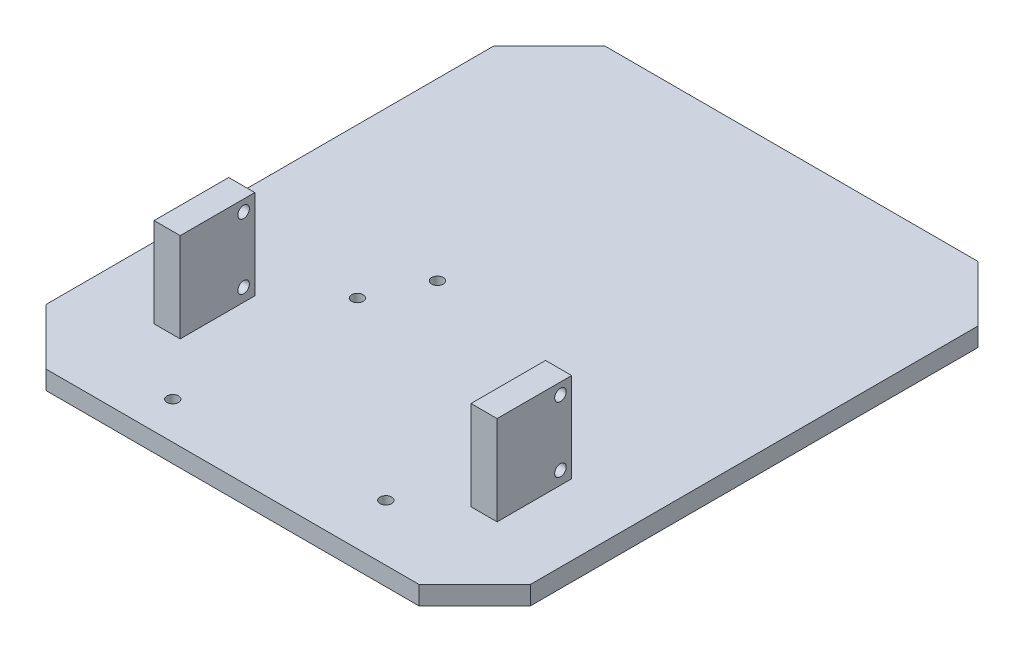
ISO-10303-21;
HEADER;
FILE_DESCRIPTION(('STEP AP214'),'2;1');
FILE_NAME('part.step','',(''),(''),'','','');
FILE_SCHEMA(('AUTOMOTIVE_DESIGN { 1 0 10303 214 1 1 1 1 }'));
ENDSEC;
DATA;
#1=APPLICATION_CONTEXT('core data for automotive mechanical design processes');
#2=APPLICATION_PROTOCOL_DEFINITION('international standard','automotive_design',2000,#1);
#3=PRODUCT_CONTEXT('',#1,'mechanical');
#4=PRODUCT('Part','Part','',(#3));
#5=PRODUCT_RELATED_PRODUCT_CATEGORY('part','',(#4));
#6=PRODUCT_DEFINITION_FORMATION('','',#4);
#7=PRODUCT_DEFINITION_CONTEXT('part definition',#1,'design');
#8=PRODUCT_DEFINITION('design','',#6,#7);
#9=PRODUCT_DEFINITION_SHAPE('','',#8);
#10=(LENGTH_UNIT() NAMED_UNIT(*) SI_UNIT(.MILLI.,.METRE.));
#11=(NAMED_UNIT(*) PLANE_ANGLE_UNIT() SI_UNIT($,.RADIAN.));
#12=(NAMED_UNIT(*) SI_UNIT($,.STERADIAN.) SOLID_ANGLE_UNIT());
#13=UNCERTAINTY_MEASURE_WITH_UNIT(LENGTH_MEASURE(1.E-05),#10,'distance_accuracy_value','');
#14=(GEOMETRIC_REPRESENTATION_CONTEXT(3) GLOBAL_UNCERTAINTY_ASSIGNED_CONTEXT((#13)) GLOBAL_UNIT_ASSIGNED_CONTEXT((#10,
#11,#12)) REPRESENTATION_CONTEXT('',''));
#15=CARTESIAN_POINT('',(0.,0.,0.));
#16=DIRECTION('',(0.,0.,1.));
#17=DIRECTION('',(1.,0.,0.));
#18=AXIS2_PLACEMENT_3D('',#15,#16,#17);
#19=CARTESIAN_POINT('',(0.,2.5,0.));
#20=DIRECTION('',(0.,1.,0.));
#21=DIRECTION('',(0.,0.,1.));
#22=AXIS2_PLACEMENT_3D('',#19,#20,#21);
#23=PLANE('',#22);
#24=DIRECTION('',(-0.707106781186547,0.,0.707106781186547));
#25=VECTOR('',#24,1.);
#26=CARTESIAN_POINT('',(65.,2.5,60.));
#27=LINE('',#26,#25);
#28=CARTESIAN_POINT('',(65.,2.5,60.));
#29=VERTEX_POINT('',#28);
#30=CARTESIAN_POINT('',(50.,2.5,75.));
#31=VERTEX_POINT('',#30);
#32=EDGE_CURVE('E150',#29,#31,#27,.T.);
#33=ORIENTED_EDGE('',*,*,#32,.F.);
#34=DIRECTION('',(0.,0.,-1.));
#35=VECTOR('',#34,1.);
#36=CARTESIAN_POINT('',(65.,2.5,-75.));
#37=LINE('',#36,#35);
#38=CARTESIAN_POINT('',(65.,2.5,-60.));
#39=VERTEX_POINT('',#38);
#40=EDGE_CURVE('E164',#29,#39,#37,.T.);
#41=ORIENTED_EDGE('',*,*,#40,.T.);
#42=DIRECTION('',(0.707106781186548,0.,0.707106781186547));
#43=VECTOR('',#42,1.);
#44=CARTESIAN_POINT('',(65.,2.5,-60.));
#45=LINE('',#44,#43);
#46=CARTESIAN_POINT('',(50.,2.5,-75.));
#47=VERTEX_POINT('',#46);
#48=EDGE_CURVE('E607',#47,#39,#45,.T.);
#49=ORIENTED_EDGE('',*,*,#48,.F.);
#50=DIRECTION('',(-1.,0.,0.));
#51=VECTOR('',#50,1.);
#52=CARTESIAN_POINT('',(-65.,2.5,-75.));
#53=LINE('',#52,#51);
#54=CARTESIAN_POINT('',(-50.,2.5,-75.));
#55=VERTEX_POINT('',#54);
#56=EDGE_CURVE('E169',#47,#55,#53,.T.);
#57=ORIENTED_EDGE('',*,*,#56,.T.);
#58=DIRECTION('',(0.707106781186547,0.,-0.707106781186548));
#59=VECTOR('',#58,1.);
#60=CARTESIAN_POINT('',(-65.,2.5,-60.));
#61=LINE('',#60,#59);
#62=CARTESIAN_POINT('',(-65.,2.5,-60.));
#63=VERTEX_POINT('',#62);
#64=EDGE_CURVE('E604',#63,#55,#61,.T.);
#65=ORIENTED_EDGE('',*,*,#64,.F.);
#66=DIRECTION('',(0.,0.,1.));
#67=VECTOR('',#66,1.);
#68=CARTESIAN_POINT('',(-65.,2.5,-75.));
#69=LINE('',#68,#67);
#70=CARTESIAN_POINT('',(-65.,2.5,60.));
#71=VERTEX_POINT('',#70);
#72=EDGE_CURVE('E42',#63,#71,#69,.T.);
#73=ORIENTED_EDGE('',*,*,#72,.T.);
#74=DIRECTION('',(-0.707106781186548,0.,-0.707106781186547));
#75=VECTOR('',#74,1.);
#76=CARTESIAN_POINT('',(-65.,2.5,60.));
#77=LINE('',#76,#75);
#78=CARTESIAN_POINT('',(-50.,2.5,75.));
#79=VERTEX_POINT('',#78);
#80=EDGE_CURVE('E200',#79,#71,#77,.T.);
#81=ORIENTED_EDGE('',*,*,#80,.F.);
#82=DIRECTION('',(1.,0.,0.));
#83=VECTOR('',#82,1.);
#84=CARTESIAN_POINT('',(-65.,2.5,75.));
#85=LINE('',#84,#83);
#86=EDGE_CURVE('E11',#79,#31,#85,.T.);
#87=ORIENTED_EDGE('',*,*,#86,.T.);
#88=EDGE_LOOP('',(#33,#41,#49,#57,#65,#73,#81,#87));
#89=FACE_BOUND('',#88,.T.);
#90=CARTESIAN_POINT('',(-18.,2.5,2.));
#91=DIRECTION('',(0.,1.,0.));
#92=DIRECTION('',(0.,0.,1.));
#93=AXIS2_PLACEMENT_3D('',#90,#91,#92);
#94=CIRCLE('',#93,1.55);
#95=CARTESIAN_POINT('',(-18.,2.5,3.55));
#96=VERTEX_POINT('',#95);
#97=EDGE_CURVE('E290',#96,#96,#94,.T.);
#98=ORIENTED_EDGE('',*,*,#97,.F.);
#99=EDGE_LOOP('',(#98));
#100=FACE_BOUND('',#99,.T.);
#101=CARTESIAN_POINT('',(26.07,2.5,59.92));
#102=DIRECTION('',(0.,1.,0.));
#103=DIRECTION('',(0.,0.,1.));
#104=AXIS2_PLACEMENT_3D('',#101,#102,#103);
#105=CIRCLE('',#104,1.55);
#106=CARTESIAN_POINT('',(26.07,2.5,61.47));
#107=VERTEX_POINT('',#106);
#108=EDGE_CURVE('E291',#107,#107,#105,.T.);
#109=ORIENTED_EDGE('',*,*,#108,.F.);
#110=EDGE_LOOP('',(#109));
#111=FACE_BOUND('',#110,.T.);
#112=CARTESIAN_POINT('',(-26.,2.5,65.));
#113=DIRECTION('',(0.,1.,0.));
#114=DIRECTION('',(0.,0.,1.));
#115=AXIS2_PLACEMENT_3D('',#112,#113,#114);
#116=CIRCLE('',#115,1.55);
#117=CARTESIAN_POINT('',(-26.,2.5,66.55));
#118=VERTEX_POINT('',#117);
#119=EDGE_CURVE('E298',#118,#118,#116,.T.);
#120=ORIENTED_EDGE('',*,*,#119,.F.);
#121=EDGE_LOOP('',(#120));
#122=FACE_BOUND('',#121,.T.);
#123=CARTESIAN_POINT('',(26.07,2.5,31.98));
#124=DIRECTION('',(0.,1.,0.));
#125=DIRECTION('',(0.,0.,1.));
#126=AXIS2_PLACEMENT_3D('',#123,#124,#125);
#127=CIRCLE('',#126,1.55);
#128=CARTESIAN_POINT('',(26.07,2.5,33.53));
#129=VERTEX_POINT('',#128);
#130=EDGE_CURVE('E303',#129,#129,#127,.T.);
#131=ORIENTED_EDGE('',*,*,#130,.F.);
#132=EDGE_LOOP('',(#131));
#133=FACE_BOUND('',#132,.T.);
#134=CARTESIAN_POINT('',(-24.73,2.5,16.74));
#135=DIRECTION('',(0.,1.,0.));
#136=DIRECTION('',(0.,0.,1.));
#137=AXIS2_PLACEMENT_3D('',#134,#135,#136);
#138=CIRCLE('',#137,1.55);
#139=CARTESIAN_POINT('',(-24.73,2.5,18.29));
#140=VERTEX_POINT('',#139);
#141=EDGE_CURVE('E310',#140,#140,#138,.T.);
#142=ORIENTED_EDGE('',*,*,#141,.F.);
#143=EDGE_LOOP('',(#142));
#144=FACE_BOUND('',#143,.T.);
#145=DIRECTION('',(1.,0.,0.));
#146=VECTOR('',#145,1.);
#147=CARTESIAN_POINT('',(-46.,2.5,50.));
#148=LINE('',#147,#146);
#149=CARTESIAN_POINT('',(-46.,2.5,50.));
#150=VERTEX_POINT('',#149);
#151=CARTESIAN_POINT('',(-39.,2.5,50.));
#152=VERTEX_POINT('',#151);
#153=EDGE_CURVE('E275',#150,#152,#148,.T.);
#154=ORIENTED_EDGE('',*,*,#153,.F.);
#155=DIRECTION('',(0.,0.,1.));
#156=VECTOR('',#155,1.);
#157=CARTESIAN_POINT('',(-46.,2.5,30.));
#158=LINE('',#157,#156);
#159=CARTESIAN_POINT('',(-46.,2.5,30.));
#160=VERTEX_POINT('',#159);
#161=EDGE_CURVE('E261',#160,#150,#158,.T.);
#162=ORIENTED_EDGE('',*,*,#161,.F.);
#163=DIRECTION('',(-1.,0.,0.));
#164=VECTOR('',#163,1.);
#165=CARTESIAN_POINT('',(-46.,2.5,30.));
#166=LINE('',#165,#164);
#167=CARTESIAN_POINT('',(-39.,2.5,30.));
#168=VERTEX_POINT('',#167);
#169=EDGE_CURVE('E266',#168,#160,#166,.T.);
#170=ORIENTED_EDGE('',*,*,#169,.F.);
#171=DIRECTION('',(0.,0.,-1.));
#172=VECTOR('',#171,1.);
#173=CARTESIAN_POINT('',(-39.,2.5,30.));
#174=LINE('',#173,#172);
#175=EDGE_CURVE('E277',#152,#168,#174,.T.);
#176=ORIENTED_EDGE('',*,*,#175,.F.);
#177=EDGE_LOOP('',(#154,#162,#170,#176));
#178=FACE_BOUND('',#177,.T.);
#179=DIRECTION('',(1.,0.,0.));
#180=VECTOR('',#179,1.);
#181=CARTESIAN_POINT('',(39.,2.5,50.));
#182=LINE('',#181,#180);
#183=CARTESIAN_POINT('',(39.,2.5,50.));
#184=VERTEX_POINT('',#183);
#185=CARTESIAN_POINT('',(46.,2.5,50.));
#186=VERTEX_POINT('',#185);
#187=EDGE_CURVE('E246',#184,#186,#182,.T.);
#188=ORIENTED_EDGE('',*,*,#187,.F.);
#189=DIRECTION('',(0.,0.,1.));
#190=VECTOR('',#189,1.);
#191=CARTESIAN_POINT('',(39.,2.5,30.));
#192=LINE('',#191,#190);
#193=CARTESIAN_POINT('',(39.,2.5,30.));
#194=VERTEX_POINT('',#193);
#195=EDGE_CURVE('E232',#194,#184,#192,.T.);
#196=ORIENTED_EDGE('',*,*,#195,.F.);
#197=DIRECTION('',(-1.,0.,0.));
#198=VECTOR('',#197,1.);
#199=CARTESIAN_POINT('',(39.,2.5,30.));
#200=LINE('',#199,#198);
#201=CARTESIAN_POINT('',(46.,2.5,30.));
#202=VERTEX_POINT('',#201);
#203=EDGE_CURVE('E237',#202,#194,#200,.T.);
#204=ORIENTED_EDGE('',*,*,#203,.F.);
#205=DIRECTION('',(0.,0.,-1.));
#206=VECTOR('',#205,1.);
#207=CARTESIAN_POINT('',(46.,2.5,30.));
#208=LINE('',#207,#206);
#209=EDGE_CURVE('E248',#186,#202,#208,.T.);
#210=ORIENTED_EDGE('',*,*,#209,.F.);
#211=EDGE_LOOP('',(#188,#196,#204,#210));
#212=FACE_BOUND('',#211,.T.);
#213=ADVANCED_FACE('F33',(#89,#100,#111,#122,#133,#144,#178,#212),#23,.T.);
#214=CARTESIAN_POINT('',(65.,2.5,-75.));
#215=DIRECTION('',(-1.,0.,0.));
#216=DIRECTION('',(0.,0.,1.));
#217=AXIS2_PLACEMENT_3D('',#214,#215,#216);
#218=PLANE('',#217);
#219=ORIENTED_EDGE('',*,*,#40,.F.);
#220=DIRECTION('',(0.,1.,0.));
#221=VECTOR('',#220,1.);
#222=CARTESIAN_POINT('',(65.,-23.7132034355964,60.));
#223=LINE('',#222,#221);
#224=CARTESIAN_POINT('',(65.,-2.50000000000001,60.));
#225=VERTEX_POINT('',#224);
#226=EDGE_CURVE('E147',#225,#29,#223,.T.);
#227=ORIENTED_EDGE('',*,*,#226,.F.);
#228=DIRECTION('',(0.,0.,-1.));
#229=VECTOR('',#228,1.);
#230=CARTESIAN_POINT('',(65.,-2.5,-75.));
#231=LINE('',#230,#229);
#232=CARTESIAN_POINT('',(65.,-2.5,-60.));
#233=VERTEX_POINT('',#232);
#234=EDGE_CURVE('E180',#225,#233,#231,.T.);
#235=ORIENTED_EDGE('',*,*,#234,.T.);
#236=DIRECTION('',(0.,1.,0.));
#237=VECTOR('',#236,1.);
#238=CARTESIAN_POINT('',(65.,-23.7132034355964,-60.));
#239=LINE('',#238,#237);
#240=EDGE_CURVE('E50',#233,#39,#239,.T.);
#241=ORIENTED_EDGE('',*,*,#240,.T.);
#242=EDGE_LOOP('',(#219,#227,#235,#241));
#243=FACE_BOUND('',#242,.T.);
#244=ADVANCED_FACE('F35',(#243),#218,.F.);
#245=CARTESIAN_POINT('',(-65.,2.5,-75.));
#246=DIRECTION('',(0.,0.,1.));
#247=DIRECTION('',(1.,0.,0.));
#248=AXIS2_PLACEMENT_3D('',#245,#246,#247);
#249=PLANE('',#248);
#250=DIRECTION('',(-1.,0.,0.));
#251=VECTOR('',#250,1.);
#252=CARTESIAN_POINT('',(-65.,-2.5,-75.));
#253=LINE('',#252,#251);
#254=CARTESIAN_POINT('',(50.,-2.5,-75.));
#255=VERTEX_POINT('',#254);
#256=CARTESIAN_POINT('',(-50.,-2.5,-75.));
#257=VERTEX_POINT('',#256);
#258=EDGE_CURVE('E182',#255,#257,#253,.T.);
#259=ORIENTED_EDGE('',*,*,#258,.T.);
#260=DIRECTION('',(0.,1.,0.));
#261=VECTOR('',#260,1.);
#262=CARTESIAN_POINT('',(-50.,-23.7132034355964,-75.));
#263=LINE('',#262,#261);
#264=EDGE_CURVE('E58',#257,#55,#263,.T.);
#265=ORIENTED_EDGE('',*,*,#264,.T.);
#266=ORIENTED_EDGE('',*,*,#56,.F.);
#267=DIRECTION('',(0.,1.,0.));
#268=VECTOR('',#267,1.);
#269=CARTESIAN_POINT('',(50.,-23.7132034355964,-75.));
#270=LINE('',#269,#268);
#271=EDGE_CURVE('E598',#255,#47,#270,.T.);
#272=ORIENTED_EDGE('',*,*,#271,.F.);
#273=EDGE_LOOP('',(#259,#265,#266,#272));
#274=FACE_BOUND('',#273,.T.);
#275=ADVANCED_FACE('F341',(#274),#249,.F.);
#276=CARTESIAN_POINT('',(-65.,2.5,-75.));
#277=DIRECTION('',(1.,0.,0.));
#278=DIRECTION('',(0.,0.,-1.));
#279=AXIS2_PLACEMENT_3D('',#276,#277,#278);
#280=PLANE('',#279);
#281=ORIENTED_EDGE('',*,*,#72,.F.);
#282=DIRECTION('',(0.,1.,0.));
#283=VECTOR('',#282,1.);
#284=CARTESIAN_POINT('',(-65.,-23.7132034355964,-60.));
#285=LINE('',#284,#283);
#286=CARTESIAN_POINT('',(-65.,-2.50000000000001,-60.));
#287=VERTEX_POINT('',#286);
#288=EDGE_CURVE('E192',#287,#63,#285,.T.);
#289=ORIENTED_EDGE('',*,*,#288,.F.);
#290=DIRECTION('',(0.,0.,1.));
#291=VECTOR('',#290,1.);
#292=CARTESIAN_POINT('',(-65.,-2.5,-75.));
#293=LINE('',#292,#291);
#294=CARTESIAN_POINT('',(-65.,-2.5,60.));
#295=VERTEX_POINT('',#294);
#296=EDGE_CURVE('E174',#287,#295,#293,.T.);
#297=ORIENTED_EDGE('',*,*,#296,.T.);
#298=DIRECTION('',(0.,1.,0.));
#299=VECTOR('',#298,1.);
#300=CARTESIAN_POINT('',(-65.,-23.7132034355964,60.));
#301=LINE('',#300,#299);
#302=EDGE_CURVE('E191',#295,#71,#301,.T.);
#303=ORIENTED_EDGE('',*,*,#302,.T.);
#304=EDGE_LOOP('',(#281,#289,#297,#303));
#305=FACE_BOUND('',#304,.T.);
#306=ADVANCED_FACE('F190',(#305),#280,.F.);
#307=CARTESIAN_POINT('',(-65.,2.5,75.));
#308=DIRECTION('',(0.,0.,-1.));
#309=DIRECTION('',(-1.,0.,0.));
#310=AXIS2_PLACEMENT_3D('',#307,#308,#309);
#311=PLANE('',#310);
#312=DIRECTION('',(1.,0.,0.));
#313=VECTOR('',#312,1.);
#314=CARTESIAN_POINT('',(-65.,-2.5,75.));
#315=LINE('',#314,#313);
#316=CARTESIAN_POINT('',(-50.,-2.5,75.));
#317=VERTEX_POINT('',#316);
#318=CARTESIAN_POINT('',(50.,-2.5,75.));
#319=VERTEX_POINT('',#318);
#320=EDGE_CURVE('E37',#317,#319,#315,.T.);
#321=ORIENTED_EDGE('',*,*,#320,.T.);
#322=DIRECTION('',(0.,1.,0.));
#323=VECTOR('',#322,1.);
#324=CARTESIAN_POINT('',(50.,-23.7132034355964,75.));
#325=LINE('',#324,#323);
#326=EDGE_CURVE('E158',#319,#31,#325,.T.);
#327=ORIENTED_EDGE('',*,*,#326,.T.);
#328=ORIENTED_EDGE('',*,*,#86,.F.);
#329=DIRECTION('',(0.,1.,0.));
#330=VECTOR('',#329,1.);
#331=CARTESIAN_POINT('',(-50.,-23.7132034355964,75.));
#332=LINE('',#331,#330);
#333=EDGE_CURVE('E201',#317,#79,#332,.T.);
#334=ORIENTED_EDGE('',*,*,#333,.F.);
#335=EDGE_LOOP('',(#321,#327,#328,#334));
#336=FACE_BOUND('',#335,.T.);
#337=ADVANCED_FACE('F323',(#336),#311,.F.);
#338=CARTESIAN_POINT('',(0.,-2.5,0.));
#339=DIRECTION('',(0.,1.,0.));
#340=DIRECTION('',(0.,0.,1.));
#341=AXIS2_PLACEMENT_3D('',#338,#339,#340);
#342=PLANE('',#341);
#343=CARTESIAN_POINT('',(-18.,-2.5,2.));
#344=DIRECTION('',(0.,1.,0.));
#345=DIRECTION('',(0.,0.,1.));
#346=AXIS2_PLACEMENT_3D('',#343,#344,#345);
#347=CIRCLE('',#346,1.55);
#348=CARTESIAN_POINT('',(-18.,-2.5,3.55));
#349=VERTEX_POINT('',#348);
#350=EDGE_CURVE('E295',#349,#349,#347,.F.);
#351=ORIENTED_EDGE('',*,*,#350,.F.);
#352=EDGE_LOOP('',(#351));
#353=FACE_BOUND('',#352,.T.);
#354=CARTESIAN_POINT('',(26.07,-2.5,59.92));
#355=DIRECTION('',(0.,1.,0.));
#356=DIRECTION('',(0.,0.,1.));
#357=AXIS2_PLACEMENT_3D('',#354,#355,#356);
#358=CIRCLE('',#357,1.55);
#359=CARTESIAN_POINT('',(26.07,-2.5,61.47));
#360=VERTEX_POINT('',#359);
#361=EDGE_CURVE('E294',#360,#360,#358,.F.);
#362=ORIENTED_EDGE('',*,*,#361,.F.);
#363=EDGE_LOOP('',(#362));
#364=FACE_BOUND('',#363,.T.);
#365=CARTESIAN_POINT('',(-26.,-2.5,65.));
#366=DIRECTION('',(0.,1.,0.));
#367=DIRECTION('',(0.,0.,1.));
#368=AXIS2_PLACEMENT_3D('',#365,#366,#367);
#369=CIRCLE('',#368,1.55);
#370=CARTESIAN_POINT('',(-26.,-2.5,66.55));
#371=VERTEX_POINT('',#370);
#372=EDGE_CURVE('E307',#371,#371,#369,.F.);
#373=ORIENTED_EDGE('',*,*,#372,.F.);
#374=EDGE_LOOP('',(#373));
#375=FACE_BOUND('',#374,.T.);
#376=CARTESIAN_POINT('',(26.07,-2.5,31.98));
#377=DIRECTION('',(0.,1.,0.));
#378=DIRECTION('',(0.,0.,1.));
#379=AXIS2_PLACEMENT_3D('',#376,#377,#378);
#380=CIRCLE('',#379,1.55);
#381=CARTESIAN_POINT('',(26.07,-2.5,33.53));
#382=VERTEX_POINT('',#381);
#383=EDGE_CURVE('E306',#382,#382,#380,.F.);
#384=ORIENTED_EDGE('',*,*,#383,.F.);
#385=EDGE_LOOP('',(#384));
#386=FACE_BOUND('',#385,.T.);
#387=CARTESIAN_POINT('',(-24.73,-2.5,16.74));
#388=DIRECTION('',(0.,1.,0.));
#389=DIRECTION('',(0.,0.,1.));
#390=AXIS2_PLACEMENT_3D('',#387,#388,#389);
#391=CIRCLE('',#390,1.55);
#392=CARTESIAN_POINT('',(-24.73,-2.5,18.29));
#393=VERTEX_POINT('',#392);
#394=EDGE_CURVE('E176',#393,#393,#391,.F.);
#395=ORIENTED_EDGE('',*,*,#394,.F.);
#396=EDGE_LOOP('',(#395));
#397=FACE_BOUND('',#396,.T.);
#398=ORIENTED_EDGE('',*,*,#234,.F.);
#399=DIRECTION('',(0.707106781186548,0.,-0.707106781186548));
#400=VECTOR('',#399,1.);
#401=CARTESIAN_POINT('',(65.,-2.5,60.));
#402=LINE('',#401,#400);
#403=EDGE_CURVE('E153',#319,#225,#402,.T.);
#404=ORIENTED_EDGE('',*,*,#403,.F.);
#405=ORIENTED_EDGE('',*,*,#320,.F.);
#406=DIRECTION('',(0.707106781186548,0.,0.707106781186547));
#407=VECTOR('',#406,1.);
#408=CARTESIAN_POINT('',(-65.,-2.5,60.));
#409=LINE('',#408,#407);
#410=EDGE_CURVE('E198',#295,#317,#409,.T.);
#411=ORIENTED_EDGE('',*,*,#410,.F.);
#412=ORIENTED_EDGE('',*,*,#296,.F.);
#413=DIRECTION('',(-0.707106781186547,0.,0.707106781186548));
#414=VECTOR('',#413,1.);
#415=CARTESIAN_POINT('',(-65.,-2.5,-60.));
#416=LINE('',#415,#414);
#417=EDGE_CURVE('E167',#257,#287,#416,.T.);
#418=ORIENTED_EDGE('',*,*,#417,.F.);
#419=ORIENTED_EDGE('',*,*,#258,.F.);
#420=DIRECTION('',(-0.707106781186548,0.,-0.707106781186547));
#421=VECTOR('',#420,1.);
#422=CARTESIAN_POINT('',(65.,-2.5,-60.));
#423=LINE('',#422,#421);
#424=EDGE_CURVE('E599',#233,#255,#423,.T.);
#425=ORIENTED_EDGE('',*,*,#424,.F.);
#426=EDGE_LOOP('',(#398,#404,#405,#411,#412,#418,#419,#425));
#427=FACE_BOUND('',#426,.T.);
#428=ADVANCED_FACE('F204',(#353,#364,#375,#386,#397,#427),#342,.F.);
#429=CARTESIAN_POINT('',(-24.73,-6.8840620433566,16.74));
#430=DIRECTION('',(0.,1.,0.));
#431=DIRECTION('',(0.,0.,1.));
#432=AXIS2_PLACEMENT_3D('',#429,#430,#431);
#433=CYLINDRICAL_SURFACE('',#432,1.55);
#434=ORIENTED_EDGE('',*,*,#394,.T.);
#435=EDGE_LOOP('',(#434));
#436=FACE_BOUND('',#435,.T.);
#437=ORIENTED_EDGE('',*,*,#141,.T.);
#438=EDGE_LOOP('',(#437));
#439=FACE_BOUND('',#438,.T.);
#440=ADVANCED_FACE('F320',(#436,#439),#433,.F.);
#441=CARTESIAN_POINT('',(26.07,-6.8840620433566,31.98));
#442=DIRECTION('',(0.,1.,0.));
#443=DIRECTION('',(0.,0.,1.));
#444=AXIS2_PLACEMENT_3D('',#441,#442,#443);
#445=CYLINDRICAL_SURFACE('',#444,1.55);
#446=ORIENTED_EDGE('',*,*,#383,.T.);
#447=EDGE_LOOP('',(#446));
#448=FACE_BOUND('',#447,.T.);
#449=ORIENTED_EDGE('',*,*,#130,.T.);
#450=EDGE_LOOP('',(#449));
#451=FACE_BOUND('',#450,.T.);
#452=ADVANCED_FACE('F330',(#448,#451),#445,.F.);
#453=CARTESIAN_POINT('',(-26.,-6.8840620433566,65.));
#454=DIRECTION('',(0.,1.,0.));
#455=DIRECTION('',(0.,0.,1.));
#456=AXIS2_PLACEMENT_3D('',#453,#454,#455);
#457=CYLINDRICAL_SURFACE('',#456,1.55);
#458=ORIENTED_EDGE('',*,*,#372,.T.);
#459=EDGE_LOOP('',(#458));
#460=FACE_BOUND('',#459,.T.);
#461=ORIENTED_EDGE('',*,*,#119,.T.);
#462=EDGE_LOOP('',(#461));
#463=FACE_BOUND('',#462,.T.);
#464=ADVANCED_FACE('F343',(#460,#463),#457,.F.);
#465=CARTESIAN_POINT('',(26.07,-6.8840620433566,59.92));
#466=DIRECTION('',(0.,1.,0.));
#467=DIRECTION('',(0.,0.,1.));
#468=AXIS2_PLACEMENT_3D('',#465,#466,#467);
#469=CYLINDRICAL_SURFACE('',#468,1.55);
#470=ORIENTED_EDGE('',*,*,#361,.T.);
#471=EDGE_LOOP('',(#470));
#472=FACE_BOUND('',#471,.T.);
#473=ORIENTED_EDGE('',*,*,#108,.T.);
#474=EDGE_LOOP('',(#473));
#475=FACE_BOUND('',#474,.T.);
#476=ADVANCED_FACE('F346',(#472,#475),#469,.F.);
#477=CARTESIAN_POINT('',(-18.,-6.8840620433566,2.));
#478=DIRECTION('',(0.,1.,0.));
#479=DIRECTION('',(0.,0.,1.));
#480=AXIS2_PLACEMENT_3D('',#477,#478,#479);
#481=CYLINDRICAL_SURFACE('',#480,1.55);
#482=ORIENTED_EDGE('',*,*,#350,.T.);
#483=EDGE_LOOP('',(#482));
#484=FACE_BOUND('',#483,.T.);
#485=ORIENTED_EDGE('',*,*,#97,.T.);
#486=EDGE_LOOP('',(#485));
#487=FACE_BOUND('',#486,.T.);
#488=ADVANCED_FACE('F351',(#484,#487),#481,.F.);
#489=CARTESIAN_POINT('',(-46.,26.5,30.));
#490=DIRECTION('',(1.,0.,0.));
#491=DIRECTION('',(0.,0.,-1.));
#492=AXIS2_PLACEMENT_3D('',#489,#490,#491);
#493=PLANE('',#492);
#494=CARTESIAN_POINT('',(-46.,6.,33.));
#495=DIRECTION('',(-1.,0.,0.));
#496=DIRECTION('',(0.,0.,1.));
#497=AXIS2_PLACEMENT_3D('',#494,#495,#496);
#498=CIRCLE('',#497,1.55);
#499=CARTESIAN_POINT('',(-46.,6.,34.55));
#500=VERTEX_POINT('',#499);
#501=EDGE_CURVE('E205',#500,#500,#498,.T.);
#502=ORIENTED_EDGE('',*,*,#501,.F.);
#503=EDGE_LOOP('',(#502));
#504=FACE_BOUND('',#503,.T.);
#505=CARTESIAN_POINT('',(-46.,23.5,33.));
#506=DIRECTION('',(-1.,0.,0.));
#507=DIRECTION('',(0.,0.,1.));
#508=AXIS2_PLACEMENT_3D('',#505,#506,#507);
#509=CIRCLE('',#508,1.54999999999999);
#510=CARTESIAN_POINT('',(-46.,23.5,34.55));
#511=VERTEX_POINT('',#510);
#512=EDGE_CURVE('E220',#511,#511,#509,.T.);
#513=ORIENTED_EDGE('',*,*,#512,.F.);
#514=EDGE_LOOP('',(#513));
#515=FACE_BOUND('',#514,.T.);
#516=ORIENTED_EDGE('',*,*,#161,.T.);
#517=DIRECTION('',(0.,-1.,0.));
#518=VECTOR('',#517,1.);
#519=CARTESIAN_POINT('',(-46.,26.5,50.));
#520=LINE('',#519,#518);
#521=CARTESIAN_POINT('',(-46.,26.5,50.));
#522=VERTEX_POINT('',#521);
#523=EDGE_CURVE('E288',#522,#150,#520,.T.);
#524=ORIENTED_EDGE('',*,*,#523,.F.);
#525=DIRECTION('',(0.,0.,1.));
#526=VECTOR('',#525,1.);
#527=CARTESIAN_POINT('',(-46.,26.5,30.));
#528=LINE('',#527,#526);
#529=CARTESIAN_POINT('',(-46.,26.5,30.));
#530=VERTEX_POINT('',#529);
#531=EDGE_CURVE('E262',#530,#522,#528,.T.);
#532=ORIENTED_EDGE('',*,*,#531,.F.);
#533=DIRECTION('',(0.,-1.,0.));
#534=VECTOR('',#533,1.);
#535=CARTESIAN_POINT('',(-46.,26.5,30.));
#536=LINE('',#535,#534);
#537=EDGE_CURVE('E272',#530,#160,#536,.T.);
#538=ORIENTED_EDGE('',*,*,#537,.T.);
#539=EDGE_LOOP('',(#516,#524,#532,#538));
#540=FACE_BOUND('',#539,.T.);
#541=ADVANCED_FACE('F354',(#504,#515,#540),#493,.F.);
#542=CARTESIAN_POINT('',(-46.,26.5,50.));
#543=DIRECTION('',(0.,0.,-1.));
#544=DIRECTION('',(-1.,0.,0.));
#545=AXIS2_PLACEMENT_3D('',#542,#543,#544);
#546=PLANE('',#545);
#547=ORIENTED_EDGE('',*,*,#153,.T.);
#548=DIRECTION('',(0.,-1.,0.));
#549=VECTOR('',#548,1.);
#550=CARTESIAN_POINT('',(-39.,26.5,50.));
#551=LINE('',#550,#549);
#552=CARTESIAN_POINT('',(-39.,26.5,50.));
#553=VERTEX_POINT('',#552);
#554=EDGE_CURVE('E285',#553,#152,#551,.T.);
#555=ORIENTED_EDGE('',*,*,#554,.F.);
#556=DIRECTION('',(1.,0.,0.));
#557=VECTOR('',#556,1.);
#558=CARTESIAN_POINT('',(-46.,26.5,50.));
#559=LINE('',#558,#557);
#560=EDGE_CURVE('E265',#522,#553,#559,.T.);
#561=ORIENTED_EDGE('',*,*,#560,.F.);
#562=ORIENTED_EDGE('',*,*,#523,.T.);
#563=EDGE_LOOP('',(#547,#555,#561,#562));
#564=FACE_BOUND('',#563,.T.);
#565=ADVANCED_FACE('F361',(#564),#546,.F.);
#566=CARTESIAN_POINT('',(-39.,26.5,30.));
#567=DIRECTION('',(-1.,0.,0.));
#568=DIRECTION('',(0.,0.,1.));
#569=AXIS2_PLACEMENT_3D('',#566,#567,#568);
#570=PLANE('',#569);
#571=CARTESIAN_POINT('',(-39.,6.,33.));
#572=DIRECTION('',(-1.,0.,0.));
#573=DIRECTION('',(0.,0.,1.));
#574=AXIS2_PLACEMENT_3D('',#571,#572,#573);
#575=CIRCLE('',#574,1.55);
#576=CARTESIAN_POINT('',(-39.,6.,34.55));
#577=VERTEX_POINT('',#576);
#578=EDGE_CURVE('E217',#577,#577,#575,.T.);
#579=ORIENTED_EDGE('',*,*,#578,.T.);
#580=EDGE_LOOP('',(#579));
#581=FACE_BOUND('',#580,.T.);
#582=CARTESIAN_POINT('',(-39.,23.5,33.));
#583=DIRECTION('',(-1.,0.,0.));
#584=DIRECTION('',(0.,0.,1.));
#585=AXIS2_PLACEMENT_3D('',#582,#583,#584);
#586=CIRCLE('',#585,1.54999999999999);
#587=CARTESIAN_POINT('',(-39.,23.5,34.55));
#588=VERTEX_POINT('',#587);
#589=EDGE_CURVE('E229',#588,#588,#586,.T.);
#590=ORIENTED_EDGE('',*,*,#589,.T.);
#591=EDGE_LOOP('',(#590));
#592=FACE_BOUND('',#591,.T.);
#593=ORIENTED_EDGE('',*,*,#175,.T.);
#594=DIRECTION('',(0.,-1.,0.));
#595=VECTOR('',#594,1.);
#596=CARTESIAN_POINT('',(-39.,26.5,30.));
#597=LINE('',#596,#595);
#598=CARTESIAN_POINT('',(-39.,26.5,30.));
#599=VERTEX_POINT('',#598);
#600=EDGE_CURVE('E283',#599,#168,#597,.T.);
#601=ORIENTED_EDGE('',*,*,#600,.F.);
#602=DIRECTION('',(0.,0.,-1.));
#603=VECTOR('',#602,1.);
#604=CARTESIAN_POINT('',(-39.,26.5,30.));
#605=LINE('',#604,#603);
#606=EDGE_CURVE('E268',#553,#599,#605,.T.);
#607=ORIENTED_EDGE('',*,*,#606,.F.);
#608=ORIENTED_EDGE('',*,*,#554,.T.);
#609=EDGE_LOOP('',(#593,#601,#607,#608));
#610=FACE_BOUND('',#609,.T.);
#611=ADVANCED_FACE('F365',(#581,#592,#610),#570,.F.);
#612=CARTESIAN_POINT('',(-46.,26.5,30.));
#613=DIRECTION('',(0.,0.,1.));
#614=DIRECTION('',(1.,0.,0.));
#615=AXIS2_PLACEMENT_3D('',#612,#613,#614);
#616=PLANE('',#615);
#617=ORIENTED_EDGE('',*,*,#169,.T.);
#618=ORIENTED_EDGE('',*,*,#537,.F.);
#619=DIRECTION('',(-1.,0.,0.));
#620=VECTOR('',#619,1.);
#621=CARTESIAN_POINT('',(-46.,26.5,30.));
#622=LINE('',#621,#620);
#623=EDGE_CURVE('E270',#599,#530,#622,.T.);
#624=ORIENTED_EDGE('',*,*,#623,.F.);
#625=ORIENTED_EDGE('',*,*,#600,.T.);
#626=EDGE_LOOP('',(#617,#618,#624,#625));
#627=FACE_BOUND('',#626,.T.);
#628=ADVANCED_FACE('F369',(#627),#616,.F.);
#629=CARTESIAN_POINT('',(0.,26.5,0.));
#630=DIRECTION('',(0.,1.,0.));
#631=DIRECTION('',(0.,0.,1.));
#632=AXIS2_PLACEMENT_3D('',#629,#630,#631);
#633=PLANE('',#632);
#634=ORIENTED_EDGE('',*,*,#531,.T.);
#635=ORIENTED_EDGE('',*,*,#560,.T.);
#636=ORIENTED_EDGE('',*,*,#606,.T.);
#637=ORIENTED_EDGE('',*,*,#623,.T.);
#638=EDGE_LOOP('',(#634,#635,#636,#637));
#639=FACE_BOUND('',#638,.T.);
#640=ADVANCED_FACE('F373',(#639),#633,.T.);
#641=CARTESIAN_POINT('',(39.,26.5,30.));
#642=DIRECTION('',(1.,0.,0.));
#643=DIRECTION('',(0.,0.,-1.));
#644=AXIS2_PLACEMENT_3D('',#641,#642,#643);
#645=PLANE('',#644);
#646=CARTESIAN_POINT('',(39.,6.,33.));
#647=DIRECTION('',(1.,0.,0.));
#648=DIRECTION('',(0.,0.,-1.));
#649=AXIS2_PLACEMENT_3D('',#646,#647,#648);
#650=CIRCLE('',#649,1.55);
#651=CARTESIAN_POINT('',(39.,6.,31.45));
#652=VERTEX_POINT('',#651);
#653=EDGE_CURVE('E214',#652,#652,#650,.T.);
#654=ORIENTED_EDGE('',*,*,#653,.T.);
#655=EDGE_LOOP('',(#654));
#656=FACE_BOUND('',#655,.T.);
#657=CARTESIAN_POINT('',(39.,23.5,33.));
#658=DIRECTION('',(1.,0.,0.));
#659=DIRECTION('',(0.,0.,-1.));
#660=AXIS2_PLACEMENT_3D('',#657,#658,#659);
#661=CIRCLE('',#660,1.54999999999999);
#662=CARTESIAN_POINT('',(39.,23.5,31.45));
#663=VERTEX_POINT('',#662);
#664=EDGE_CURVE('E226',#663,#663,#661,.T.);
#665=ORIENTED_EDGE('',*,*,#664,.T.);
#666=EDGE_LOOP('',(#665));
#667=FACE_BOUND('',#666,.T.);
#668=ORIENTED_EDGE('',*,*,#195,.T.);
#669=DIRECTION('',(0.,-1.,0.));
#670=VECTOR('',#669,1.);
#671=CARTESIAN_POINT('',(39.,26.5,50.));
#672=LINE('',#671,#670);
#673=CARTESIAN_POINT('',(39.,26.5,50.));
#674=VERTEX_POINT('',#673);
#675=EDGE_CURVE('E259',#674,#184,#672,.T.);
#676=ORIENTED_EDGE('',*,*,#675,.F.);
#677=DIRECTION('',(0.,0.,1.));
#678=VECTOR('',#677,1.);
#679=CARTESIAN_POINT('',(39.,26.5,30.));
#680=LINE('',#679,#678);
#681=CARTESIAN_POINT('',(39.,26.5,30.));
#682=VERTEX_POINT('',#681);
#683=EDGE_CURVE('E233',#682,#674,#680,.T.);
#684=ORIENTED_EDGE('',*,*,#683,.F.);
#685=DIRECTION('',(0.,-1.,0.));
#686=VECTOR('',#685,1.);
#687=CARTESIAN_POINT('',(39.,26.5,30.));
#688=LINE('',#687,#686);
#689=EDGE_CURVE('E243',#682,#194,#688,.T.);
#690=ORIENTED_EDGE('',*,*,#689,.T.);
#691=EDGE_LOOP('',(#668,#676,#684,#690));
#692=FACE_BOUND('',#691,.T.);
#693=ADVANCED_FACE('F377',(#656,#667,#692),#645,.F.);
#694=CARTESIAN_POINT('',(39.,26.5,50.));
#695=DIRECTION('',(0.,0.,-1.));
#696=DIRECTION('',(-1.,0.,0.));
#697=AXIS2_PLACEMENT_3D('',#694,#695,#696);
#698=PLANE('',#697);
#699=ORIENTED_EDGE('',*,*,#187,.T.);
#700=DIRECTION('',(0.,-1.,0.));
#701=VECTOR('',#700,1.);
#702=CARTESIAN_POINT('',(46.,26.5,50.));
#703=LINE('',#702,#701);
#704=CARTESIAN_POINT('',(46.,26.5,50.));
#705=VERTEX_POINT('',#704);
#706=EDGE_CURVE('E256',#705,#186,#703,.T.);
#707=ORIENTED_EDGE('',*,*,#706,.F.);
#708=DIRECTION('',(1.,0.,0.));
#709=VECTOR('',#708,1.);
#710=CARTESIAN_POINT('',(39.,26.5,50.));
#711=LINE('',#710,#709);
#712=EDGE_CURVE('E236',#674,#705,#711,.T.);
#713=ORIENTED_EDGE('',*,*,#712,.F.);
#714=ORIENTED_EDGE('',*,*,#675,.T.);
#715=EDGE_LOOP('',(#699,#707,#713,#714));
#716=FACE_BOUND('',#715,.T.);
#717=ADVANCED_FACE('F381',(#716),#698,.F.);
#718=CARTESIAN_POINT('',(46.,26.5,30.));
#719=DIRECTION('',(-1.,0.,0.));
#720=DIRECTION('',(0.,0.,1.));
#721=AXIS2_PLACEMENT_3D('',#718,#719,#720);
#722=PLANE('',#721);
#723=CARTESIAN_POINT('',(46.,6.,33.));
#724=DIRECTION('',(-1.,0.,0.));
#725=DIRECTION('',(0.,0.,1.));
#726=AXIS2_PLACEMENT_3D('',#723,#724,#725);
#727=CIRCLE('',#726,1.55);
#728=CARTESIAN_POINT('',(46.,6.,34.55));
#729=VERTEX_POINT('',#728);
#730=EDGE_CURVE('E208',#729,#729,#727,.F.);
#731=ORIENTED_EDGE('',*,*,#730,.F.);
#732=EDGE_LOOP('',(#731));
#733=FACE_BOUND('',#732,.T.);
#734=CARTESIAN_POINT('',(46.,23.5,33.));
#735=DIRECTION('',(-1.,0.,0.));
#736=DIRECTION('',(0.,0.,1.));
#737=AXIS2_PLACEMENT_3D('',#734,#735,#736);
#738=CIRCLE('',#737,1.54999999999999);
#739=CARTESIAN_POINT('',(46.,23.5,34.55));
#740=VERTEX_POINT('',#739);
#741=EDGE_CURVE('E223',#740,#740,#738,.F.);
#742=ORIENTED_EDGE('',*,*,#741,.F.);
#743=EDGE_LOOP('',(#742));
#744=FACE_BOUND('',#743,.T.);
#745=ORIENTED_EDGE('',*,*,#209,.T.);
#746=DIRECTION('',(0.,-1.,0.));
#747=VECTOR('',#746,1.);
#748=CARTESIAN_POINT('',(46.,26.5,30.));
#749=LINE('',#748,#747);
#750=CARTESIAN_POINT('',(46.,26.5,30.));
#751=VERTEX_POINT('',#750);
#752=EDGE_CURVE('E254',#751,#202,#749,.T.);
#753=ORIENTED_EDGE('',*,*,#752,.F.);
#754=DIRECTION('',(0.,0.,-1.));
#755=VECTOR('',#754,1.);
#756=CARTESIAN_POINT('',(46.,26.5,30.));
#757=LINE('',#756,#755);
#758=EDGE_CURVE('E239',#705,#751,#757,.T.);
#759=ORIENTED_EDGE('',*,*,#758,.F.);
#760=ORIENTED_EDGE('',*,*,#706,.T.);
#761=EDGE_LOOP('',(#745,#753,#759,#760));
#762=FACE_BOUND('',#761,.T.);
#763=ADVANCED_FACE('F385',(#733,#744,#762),#722,.F.);
#764=CARTESIAN_POINT('',(39.,26.5,30.));
#765=DIRECTION('',(0.,0.,1.));
#766=DIRECTION('',(1.,0.,0.));
#767=AXIS2_PLACEMENT_3D('',#764,#765,#766);
#768=PLANE('',#767);
#769=ORIENTED_EDGE('',*,*,#203,.T.);
#770=ORIENTED_EDGE('',*,*,#689,.F.);
#771=DIRECTION('',(-1.,0.,0.));
#772=VECTOR('',#771,1.);
#773=CARTESIAN_POINT('',(39.,26.5,30.));
#774=LINE('',#773,#772);
#775=EDGE_CURVE('E241',#751,#682,#774,.T.);
#776=ORIENTED_EDGE('',*,*,#775,.F.);
#777=ORIENTED_EDGE('',*,*,#752,.T.);
#778=EDGE_LOOP('',(#769,#770,#776,#777));
#779=FACE_BOUND('',#778,.T.);
#780=ADVANCED_FACE('F389',(#779),#768,.F.);
#781=CARTESIAN_POINT('',(0.,26.5,0.));
#782=DIRECTION('',(0.,1.,0.));
#783=DIRECTION('',(0.,0.,1.));
#784=AXIS2_PLACEMENT_3D('',#781,#782,#783);
#785=PLANE('',#784);
#786=ORIENTED_EDGE('',*,*,#683,.T.);
#787=ORIENTED_EDGE('',*,*,#712,.T.);
#788=ORIENTED_EDGE('',*,*,#758,.T.);
#789=ORIENTED_EDGE('',*,*,#775,.T.);
#790=EDGE_LOOP('',(#786,#787,#788,#789));
#791=FACE_BOUND('',#790,.T.);
#792=ADVANCED_FACE('F393',(#791),#785,.T.);
#793=CARTESIAN_POINT('',(50.3840620433566,23.5,33.));
#794=DIRECTION('',(-1.,0.,0.));
#795=DIRECTION('',(0.,0.,1.));
#796=AXIS2_PLACEMENT_3D('',#793,#794,#795);
#797=CYLINDRICAL_SURFACE('',#796,1.54999999999999);
#798=ORIENTED_EDGE('',*,*,#741,.T.);
#799=EDGE_LOOP('',(#798));
#800=FACE_BOUND('',#799,.T.);
#801=ORIENTED_EDGE('',*,*,#664,.F.);
#802=EDGE_LOOP('',(#801));
#803=FACE_BOUND('',#802,.T.);
#804=ADVANCED_FACE('F397',(#800,#803),#797,.F.);
#805=ORIENTED_EDGE('',*,*,#512,.T.);
#806=EDGE_LOOP('',(#805));
#807=FACE_BOUND('',#806,.T.);
#808=ORIENTED_EDGE('',*,*,#589,.F.);
#809=EDGE_LOOP('',(#808));
#810=FACE_BOUND('',#809,.T.);
#811=ADVANCED_FACE('F399',(#807,#810),#797,.F.);
#812=CARTESIAN_POINT('',(50.3840620433566,6.,33.));
#813=DIRECTION('',(-1.,0.,0.));
#814=DIRECTION('',(0.,0.,1.));
#815=AXIS2_PLACEMENT_3D('',#812,#813,#814);
#816=CYLINDRICAL_SURFACE('',#815,1.55);
#817=ORIENTED_EDGE('',*,*,#730,.T.);
#818=EDGE_LOOP('',(#817));
#819=FACE_BOUND('',#818,.T.);
#820=ORIENTED_EDGE('',*,*,#653,.F.);
#821=EDGE_LOOP('',(#820));
#822=FACE_BOUND('',#821,.T.);
#823=ADVANCED_FACE('F402',(#819,#822),#816,.F.);
#824=ORIENTED_EDGE('',*,*,#501,.T.);
#825=EDGE_LOOP('',(#824));
#826=FACE_BOUND('',#825,.T.);
#827=ORIENTED_EDGE('',*,*,#578,.F.);
#828=EDGE_LOOP('',(#827));
#829=FACE_BOUND('',#828,.T.);
#830=ADVANCED_FACE('F404',(#826,#829),#816,.F.);
#831=CARTESIAN_POINT('',(-65.,-23.7132034355964,60.));
#832=DIRECTION('',(0.707106781186547,0.,-0.707106781186548));
#833=DIRECTION('',(-0.707106781186548,0.,-0.707106781186547));
#834=AXIS2_PLACEMENT_3D('',#831,#832,#833);
#835=PLANE('',#834);
#836=ORIENTED_EDGE('',*,*,#410,.T.);
#837=ORIENTED_EDGE('',*,*,#333,.T.);
#838=ORIENTED_EDGE('',*,*,#80,.T.);
#839=ORIENTED_EDGE('',*,*,#302,.F.);
#840=EDGE_LOOP('',(#836,#837,#838,#839));
#841=FACE_BOUND('',#840,.T.);
#842=ADVANCED_FACE('F197',(#841),#835,.F.);
#843=CARTESIAN_POINT('',(65.,-23.7132034355964,-60.));
#844=DIRECTION('',(-0.707106781186547,0.,0.707106781186548));
#845=DIRECTION('',(0.707106781186548,0.,0.707106781186547));
#846=AXIS2_PLACEMENT_3D('',#843,#844,#845);
#847=PLANE('',#846);
#848=ORIENTED_EDGE('',*,*,#424,.T.);
#849=ORIENTED_EDGE('',*,*,#271,.T.);
#850=ORIENTED_EDGE('',*,*,#48,.T.);
#851=ORIENTED_EDGE('',*,*,#240,.F.);
#852=EDGE_LOOP('',(#848,#849,#850,#851));
#853=FACE_BOUND('',#852,.T.);
#854=ADVANCED_FACE('F410',(#853),#847,.F.);
#855=CARTESIAN_POINT('',(-65.,-23.7132034355964,-60.));
#856=DIRECTION('',(0.707106781186548,0.,0.707106781186547));
#857=DIRECTION('',(0.707106781186547,0.,-0.707106781186548));
#858=AXIS2_PLACEMENT_3D('',#855,#856,#857);
#859=PLANE('',#858);
#860=ORIENTED_EDGE('',*,*,#417,.T.);
#861=ORIENTED_EDGE('',*,*,#288,.T.);
#862=ORIENTED_EDGE('',*,*,#64,.T.);
#863=ORIENTED_EDGE('',*,*,#264,.F.);
#864=EDGE_LOOP('',(#860,#861,#862,#863));
#865=FACE_BOUND('',#864,.T.);
#866=ADVANCED_FACE('F413',(#865),#859,.F.);
#867=CARTESIAN_POINT('',(65.,-23.7132034355964,60.));
#868=DIRECTION('',(-0.707106781186547,0.,-0.707106781186547));
#869=DIRECTION('',(-0.707106781186548,0.,0.707106781186548));
#870=AXIS2_PLACEMENT_3D('',#867,#868,#869);
#871=PLANE('',#870);
#872=ORIENTED_EDGE('',*,*,#403,.T.);
#873=ORIENTED_EDGE('',*,*,#226,.T.);
#874=ORIENTED_EDGE('',*,*,#32,.T.);
#875=ORIENTED_EDGE('',*,*,#326,.F.);
#876=EDGE_LOOP('',(#872,#873,#874,#875));
#877=FACE_BOUND('',#876,.T.);
#878=ADVANCED_FACE('F149',(#877),#871,.F.);
#879=CLOSED_SHELL('',(#213,#244,#275,#306,#337,#428,#440,#452,#464,#476,#488,#541,#565,#611,
#628,#640,#693,#717,#763,#780,#792,#804,#811,#823,#830,#842,#854,#866,#878));
#880=MANIFOLD_SOLID_BREP('B2',#879);
#881=ADVANCED_BREP_SHAPE_REPRESENTATION('',(#18,#880),#14);
#882=SHAPE_DEFINITION_REPRESENTATION(#9,#881);
ENDSEC;
END-ISO-10303-21;
